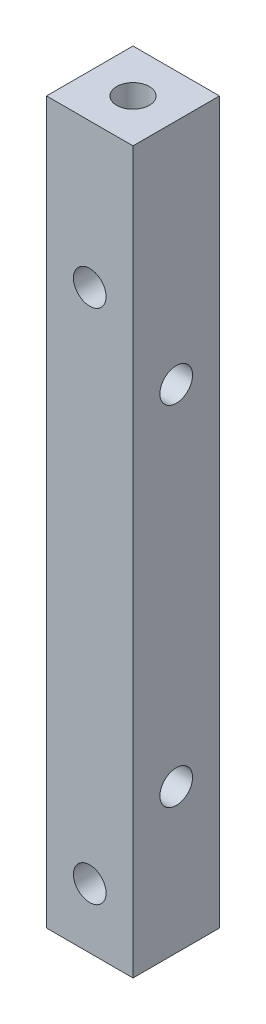
ISO-10303-21;
HEADER;
FILE_DESCRIPTION(('STEP AP214'),'2;1');
FILE_NAME('part.step','',(''),(''),'','','');
FILE_SCHEMA(('AUTOMOTIVE_DESIGN { 1 0 10303 214 1 1 1 1 }'));
ENDSEC;
DATA;
#1=APPLICATION_CONTEXT('core data for automotive mechanical design processes');
#2=APPLICATION_PROTOCOL_DEFINITION('international standard','automotive_design',2000,#1);
#3=PRODUCT_CONTEXT('',#1,'mechanical');
#4=PRODUCT('Part','Part','',(#3));
#5=PRODUCT_RELATED_PRODUCT_CATEGORY('part','',(#4));
#6=PRODUCT_DEFINITION_FORMATION('','',#4);
#7=PRODUCT_DEFINITION_CONTEXT('part definition',#1,'design');
#8=PRODUCT_DEFINITION('design','',#6,#7);
#9=PRODUCT_DEFINITION_SHAPE('','',#8);
#10=(LENGTH_UNIT() NAMED_UNIT(*) SI_UNIT(.MILLI.,.METRE.));
#11=(NAMED_UNIT(*) PLANE_ANGLE_UNIT() SI_UNIT($,.RADIAN.));
#12=(NAMED_UNIT(*) SI_UNIT($,.STERADIAN.) SOLID_ANGLE_UNIT());
#13=UNCERTAINTY_MEASURE_WITH_UNIT(LENGTH_MEASURE(1.E-05),#10,'distance_accuracy_value','');
#14=(GEOMETRIC_REPRESENTATION_CONTEXT(3) GLOBAL_UNCERTAINTY_ASSIGNED_CONTEXT((#13)) GLOBAL_UNIT_ASSIGNED_CONTEXT((#10,
#11,#12)) REPRESENTATION_CONTEXT('',''));
#15=CARTESIAN_POINT('',(0.,0.,0.));
#16=DIRECTION('',(0.,0.,1.));
#17=DIRECTION('',(1.,0.,0.));
#18=AXIS2_PLACEMENT_3D('',#15,#16,#17);
#19=CARTESIAN_POINT('',(4.572,76.2,-4.572));
#20=DIRECTION('',(-1.,0.,0.));
#21=DIRECTION('',(0.,0.,1.));
#22=AXIS2_PLACEMENT_3D('',#19,#20,#21);
#23=PLANE('',#22);
#24=CARTESIAN_POINT('',(4.572,52.07,0.));
#25=DIRECTION('',(1.,0.,0.));
#26=DIRECTION('',(0.,0.,-1.));
#27=AXIS2_PLACEMENT_3D('',#24,#25,#26);
#28=CIRCLE('',#27,1.7272);
#29=CARTESIAN_POINT('',(4.572,52.07,-1.7272));
#30=VERTEX_POINT('',#29);
#31=EDGE_CURVE('E101',#30,#30,#28,.T.);
#32=ORIENTED_EDGE('',*,*,#31,.F.);
#33=EDGE_LOOP('',(#32));
#34=FACE_BOUND('',#33,.T.);
#35=CARTESIAN_POINT('',(4.572,15.24,0.));
#36=DIRECTION('',(1.,0.,0.));
#37=DIRECTION('',(0.,0.,-1.));
#38=AXIS2_PLACEMENT_3D('',#35,#36,#37);
#39=CIRCLE('',#38,1.7272);
#40=CARTESIAN_POINT('',(4.572,15.24,-1.7272));
#41=VERTEX_POINT('',#40);
#42=EDGE_CURVE('E112',#41,#41,#39,.T.);
#43=ORIENTED_EDGE('',*,*,#42,.F.);
#44=EDGE_LOOP('',(#43));
#45=FACE_BOUND('',#44,.T.);
#46=DIRECTION('',(0.,0.,-1.));
#47=VECTOR('',#46,1.);
#48=CARTESIAN_POINT('',(4.572,0.,-4.572));
#49=LINE('',#48,#47);
#50=CARTESIAN_POINT('',(4.572,0.,4.572));
#51=VERTEX_POINT('',#50);
#52=CARTESIAN_POINT('',(4.572,0.,-4.572));
#53=VERTEX_POINT('',#52);
#54=EDGE_CURVE('E130',#51,#53,#49,.T.);
#55=ORIENTED_EDGE('',*,*,#54,.T.);
#56=DIRECTION('',(0.,-1.,0.));
#57=VECTOR('',#56,1.);
#58=CARTESIAN_POINT('',(4.572,76.2,-4.572));
#59=LINE('',#58,#57);
#60=CARTESIAN_POINT('',(4.572,76.2,-4.572));
#61=VERTEX_POINT('',#60);
#62=EDGE_CURVE('E11',#61,#53,#59,.T.);
#63=ORIENTED_EDGE('',*,*,#62,.F.);
#64=DIRECTION('',(0.,0.,-1.));
#65=VECTOR('',#64,1.);
#66=CARTESIAN_POINT('',(4.572,76.2,-4.572));
#67=LINE('',#66,#65);
#68=CARTESIAN_POINT('',(4.572,76.2,4.572));
#69=VERTEX_POINT('',#68);
#70=EDGE_CURVE('E131',#69,#61,#67,.T.);
#71=ORIENTED_EDGE('',*,*,#70,.F.);
#72=DIRECTION('',(0.,-1.,0.));
#73=VECTOR('',#72,1.);
#74=CARTESIAN_POINT('',(4.572,76.2,4.572));
#75=LINE('',#74,#73);
#76=EDGE_CURVE('E137',#69,#51,#75,.T.);
#77=ORIENTED_EDGE('',*,*,#76,.T.);
#78=EDGE_LOOP('',(#55,#63,#71,#77));
#79=FACE_BOUND('',#78,.T.);
#80=ADVANCED_FACE('F40',(#34,#45,#79),#23,.F.);
#81=CARTESIAN_POINT('',(-4.572,76.2,-4.572));
#82=DIRECTION('',(0.,0.,1.));
#83=DIRECTION('',(1.,0.,0.));
#84=AXIS2_PLACEMENT_3D('',#81,#82,#83);
#85=PLANE('',#84);
#86=CARTESIAN_POINT('',(0.,60.96,-4.572));
#87=DIRECTION('',(0.,0.,1.));
#88=DIRECTION('',(1.,0.,0.));
#89=AXIS2_PLACEMENT_3D('',#86,#87,#88);
#90=CIRCLE('',#89,1.7272);
#91=CARTESIAN_POINT('',(1.7272,60.96,-4.572));
#92=VERTEX_POINT('',#91);
#93=EDGE_CURVE('E121',#92,#92,#90,.T.);
#94=ORIENTED_EDGE('',*,*,#93,.T.);
#95=EDGE_LOOP('',(#94));
#96=FACE_BOUND('',#95,.T.);
#97=CARTESIAN_POINT('',(0.,6.35000000000001,-4.572));
#98=DIRECTION('',(0.,0.,1.));
#99=DIRECTION('',(1.,0.,0.));
#100=AXIS2_PLACEMENT_3D('',#97,#98,#99);
#101=CIRCLE('',#100,1.7272);
#102=CARTESIAN_POINT('',(1.72720000000001,6.35000000000001,-4.572));
#103=VERTEX_POINT('',#102);
#104=EDGE_CURVE('E127',#103,#103,#101,.T.);
#105=ORIENTED_EDGE('',*,*,#104,.T.);
#106=EDGE_LOOP('',(#105));
#107=FACE_BOUND('',#106,.T.);
#108=DIRECTION('',(-1.,0.,0.));
#109=VECTOR('',#108,1.);
#110=CARTESIAN_POINT('',(-4.572,0.,-4.572));
#111=LINE('',#110,#109);
#112=CARTESIAN_POINT('',(-4.572,0.,-4.572));
#113=VERTEX_POINT('',#112);
#114=EDGE_CURVE('E140',#53,#113,#111,.T.);
#115=ORIENTED_EDGE('',*,*,#114,.T.);
#116=DIRECTION('',(0.,-1.,0.));
#117=VECTOR('',#116,1.);
#118=CARTESIAN_POINT('',(-4.572,76.2,-4.572));
#119=LINE('',#118,#117);
#120=CARTESIAN_POINT('',(-4.572,76.2,-4.572));
#121=VERTEX_POINT('',#120);
#122=EDGE_CURVE('E48',#121,#113,#119,.T.);
#123=ORIENTED_EDGE('',*,*,#122,.F.);
#124=DIRECTION('',(-1.,0.,0.));
#125=VECTOR('',#124,1.);
#126=CARTESIAN_POINT('',(-4.572,76.2,-4.572));
#127=LINE('',#126,#125);
#128=EDGE_CURVE('E87',#61,#121,#127,.T.);
#129=ORIENTED_EDGE('',*,*,#128,.F.);
#130=ORIENTED_EDGE('',*,*,#62,.T.);
#131=EDGE_LOOP('',(#115,#123,#129,#130));
#132=FACE_BOUND('',#131,.T.);
#133=ADVANCED_FACE('F165',(#96,#107,#132),#85,.F.);
#134=CARTESIAN_POINT('',(-4.572,76.2,-4.572));
#135=DIRECTION('',(1.,0.,0.));
#136=DIRECTION('',(0.,0.,-1.));
#137=AXIS2_PLACEMENT_3D('',#134,#135,#136);
#138=PLANE('',#137);
#139=CARTESIAN_POINT('',(-4.572,52.07,0.));
#140=DIRECTION('',(1.,0.,0.));
#141=DIRECTION('',(0.,0.,-1.));
#142=AXIS2_PLACEMENT_3D('',#139,#140,#141);
#143=CIRCLE('',#142,1.7272);
#144=CARTESIAN_POINT('',(-4.572,52.07,-1.7272));
#145=VERTEX_POINT('',#144);
#146=EDGE_CURVE('E105',#145,#145,#143,.T.);
#147=ORIENTED_EDGE('',*,*,#146,.T.);
#148=EDGE_LOOP('',(#147));
#149=FACE_BOUND('',#148,.T.);
#150=CARTESIAN_POINT('',(-4.572,15.24,0.));
#151=DIRECTION('',(1.,0.,0.));
#152=DIRECTION('',(0.,0.,-1.));
#153=AXIS2_PLACEMENT_3D('',#150,#151,#152);
#154=CIRCLE('',#153,1.7272);
#155=CARTESIAN_POINT('',(-4.572,15.24,-1.7272));
#156=VERTEX_POINT('',#155);
#157=EDGE_CURVE('E115',#156,#156,#154,.T.);
#158=ORIENTED_EDGE('',*,*,#157,.T.);
#159=EDGE_LOOP('',(#158));
#160=FACE_BOUND('',#159,.T.);
#161=DIRECTION('',(0.,0.,1.));
#162=VECTOR('',#161,1.);
#163=CARTESIAN_POINT('',(-4.572,0.,-4.572));
#164=LINE('',#163,#162);
#165=CARTESIAN_POINT('',(-4.572,0.,4.572));
#166=VERTEX_POINT('',#165);
#167=EDGE_CURVE('E74',#113,#166,#164,.T.);
#168=ORIENTED_EDGE('',*,*,#167,.T.);
#169=DIRECTION('',(0.,-1.,0.));
#170=VECTOR('',#169,1.);
#171=CARTESIAN_POINT('',(-4.572,76.2,4.572));
#172=LINE('',#171,#170);
#173=CARTESIAN_POINT('',(-4.572,76.2,4.572));
#174=VERTEX_POINT('',#173);
#175=EDGE_CURVE('E145',#174,#166,#172,.T.);
#176=ORIENTED_EDGE('',*,*,#175,.F.);
#177=DIRECTION('',(0.,0.,1.));
#178=VECTOR('',#177,1.);
#179=CARTESIAN_POINT('',(-4.572,76.2,-4.572));
#180=LINE('',#179,#178);
#181=EDGE_CURVE('E134',#121,#174,#180,.T.);
#182=ORIENTED_EDGE('',*,*,#181,.F.);
#183=ORIENTED_EDGE('',*,*,#122,.T.);
#184=EDGE_LOOP('',(#168,#176,#182,#183));
#185=FACE_BOUND('',#184,.T.);
#186=ADVANCED_FACE('F147',(#149,#160,#185),#138,.F.);
#187=CARTESIAN_POINT('',(-4.572,76.2,4.572));
#188=DIRECTION('',(0.,0.,-1.));
#189=DIRECTION('',(-1.,0.,0.));
#190=AXIS2_PLACEMENT_3D('',#187,#188,#189);
#191=PLANE('',#190);
#192=CARTESIAN_POINT('',(0.,60.96,4.572));
#193=DIRECTION('',(0.,0.,1.));
#194=DIRECTION('',(1.,0.,0.));
#195=AXIS2_PLACEMENT_3D('',#192,#193,#194);
#196=CIRCLE('',#195,1.7272);
#197=CARTESIAN_POINT('',(1.7272,60.96,4.572));
#198=VERTEX_POINT('',#197);
#199=EDGE_CURVE('E118',#198,#198,#196,.T.);
#200=ORIENTED_EDGE('',*,*,#199,.F.);
#201=EDGE_LOOP('',(#200));
#202=FACE_BOUND('',#201,.T.);
#203=CARTESIAN_POINT('',(0.,6.35000000000001,4.572));
#204=DIRECTION('',(0.,0.,1.));
#205=DIRECTION('',(1.,0.,0.));
#206=AXIS2_PLACEMENT_3D('',#203,#204,#205);
#207=CIRCLE('',#206,1.7272);
#208=CARTESIAN_POINT('',(1.72720000000001,6.35000000000001,4.572));
#209=VERTEX_POINT('',#208);
#210=EDGE_CURVE('E124',#209,#209,#207,.T.);
#211=ORIENTED_EDGE('',*,*,#210,.F.);
#212=EDGE_LOOP('',(#211));
#213=FACE_BOUND('',#212,.T.);
#214=DIRECTION('',(1.,0.,0.));
#215=VECTOR('',#214,1.);
#216=CARTESIAN_POINT('',(-4.572,0.,4.572));
#217=LINE('',#216,#215);
#218=EDGE_CURVE('E80',#166,#51,#217,.T.);
#219=ORIENTED_EDGE('',*,*,#218,.T.);
#220=ORIENTED_EDGE('',*,*,#76,.F.);
#221=DIRECTION('',(1.,0.,0.));
#222=VECTOR('',#221,1.);
#223=CARTESIAN_POINT('',(-4.572,76.2,4.572));
#224=LINE('',#223,#222);
#225=EDGE_CURVE('E56',#174,#69,#224,.T.);
#226=ORIENTED_EDGE('',*,*,#225,.F.);
#227=ORIENTED_EDGE('',*,*,#175,.T.);
#228=EDGE_LOOP('',(#219,#220,#226,#227));
#229=FACE_BOUND('',#228,.T.);
#230=ADVANCED_FACE('F154',(#202,#213,#229),#191,.F.);
#231=CARTESIAN_POINT('',(0.,76.2,0.));
#232=DIRECTION('',(0.,1.,0.));
#233=DIRECTION('',(0.,0.,1.));
#234=AXIS2_PLACEMENT_3D('',#231,#232,#233);
#235=PLANE('',#234);
#236=CARTESIAN_POINT('',(0.,76.2,0.));
#237=DIRECTION('',(0.,1.,0.));
#238=DIRECTION('',(0.,0.,1.));
#239=AXIS2_PLACEMENT_3D('',#236,#237,#238);
#240=CIRCLE('',#239,1.72719999999999);
#241=CARTESIAN_POINT('',(0.,76.2,1.72719999999999));
#242=VERTEX_POINT('',#241);
#243=EDGE_CURVE('E102',#242,#242,#240,.T.);
#244=ORIENTED_EDGE('',*,*,#243,.F.);
#245=EDGE_LOOP('',(#244));
#246=FACE_BOUND('',#245,.T.);
#247=ORIENTED_EDGE('',*,*,#70,.T.);
#248=ORIENTED_EDGE('',*,*,#128,.T.);
#249=ORIENTED_EDGE('',*,*,#181,.T.);
#250=ORIENTED_EDGE('',*,*,#225,.T.);
#251=EDGE_LOOP('',(#247,#248,#249,#250));
#252=FACE_BOUND('',#251,.T.);
#253=ADVANCED_FACE('F156',(#246,#252),#235,.T.);
#254=CARTESIAN_POINT('',(0.,0.,0.));
#255=DIRECTION('',(0.,1.,0.));
#256=DIRECTION('',(0.,0.,1.));
#257=AXIS2_PLACEMENT_3D('',#254,#255,#256);
#258=PLANE('',#257);
#259=ORIENTED_EDGE('',*,*,#54,.F.);
#260=ORIENTED_EDGE('',*,*,#218,.F.);
#261=ORIENTED_EDGE('',*,*,#167,.F.);
#262=ORIENTED_EDGE('',*,*,#114,.F.);
#263=EDGE_LOOP('',(#259,#260,#261,#262));
#264=FACE_BOUND('',#263,.T.);
#265=ADVANCED_FACE('F150',(#264),#258,.F.);
#266=CARTESIAN_POINT('',(0.,6.35000000000001,4.572));
#267=DIRECTION('',(0.,0.,1.));
#268=DIRECTION('',(1.,0.,0.));
#269=AXIS2_PLACEMENT_3D('',#266,#267,#268);
#270=CYLINDRICAL_SURFACE('',#269,1.7272);
#271=ORIENTED_EDGE('',*,*,#104,.F.);
#272=EDGE_LOOP('',(#271));
#273=FACE_BOUND('',#272,.T.);
#274=ORIENTED_EDGE('',*,*,#210,.T.);
#275=EDGE_LOOP('',(#274));
#276=FACE_BOUND('',#275,.T.);
#277=ADVANCED_FACE('F192',(#273,#276),#270,.F.);
#278=CARTESIAN_POINT('',(0.,60.96,4.572));
#279=DIRECTION('',(0.,0.,1.));
#280=DIRECTION('',(1.,0.,0.));
#281=AXIS2_PLACEMENT_3D('',#278,#279,#280);
#282=CYLINDRICAL_SURFACE('',#281,1.7272);
#283=ORIENTED_EDGE('',*,*,#93,.F.);
#284=EDGE_LOOP('',(#283));
#285=FACE_BOUND('',#284,.T.);
#286=ORIENTED_EDGE('',*,*,#199,.T.);
#287=EDGE_LOOP('',(#286));
#288=FACE_BOUND('',#287,.T.);
#289=ADVANCED_FACE('F183',(#285,#288),#282,.F.);
#290=CARTESIAN_POINT('',(4.572,15.24,0.));
#291=DIRECTION('',(1.,0.,0.));
#292=DIRECTION('',(0.,0.,-1.));
#293=AXIS2_PLACEMENT_3D('',#290,#291,#292);
#294=CYLINDRICAL_SURFACE('',#293,1.7272);
#295=ORIENTED_EDGE('',*,*,#157,.F.);
#296=EDGE_LOOP('',(#295));
#297=FACE_BOUND('',#296,.T.);
#298=ORIENTED_EDGE('',*,*,#42,.T.);
#299=EDGE_LOOP('',(#298));
#300=FACE_BOUND('',#299,.T.);
#301=ADVANCED_FACE('F181',(#297,#300),#294,.F.);
#302=CARTESIAN_POINT('',(4.572,52.07,0.));
#303=DIRECTION('',(1.,0.,0.));
#304=DIRECTION('',(0.,0.,-1.));
#305=AXIS2_PLACEMENT_3D('',#302,#303,#304);
#306=CYLINDRICAL_SURFACE('',#305,1.7272);
#307=ORIENTED_EDGE('',*,*,#146,.F.);
#308=EDGE_LOOP('',(#307));
#309=FACE_BOUND('',#308,.T.);
#310=ORIENTED_EDGE('',*,*,#31,.T.);
#311=EDGE_LOOP('',(#310));
#312=FACE_BOUND('',#311,.T.);
#313=ADVANCED_FACE('F95',(#309,#312),#306,.F.);
#314=CARTESIAN_POINT('',(0.,68.58,0.));
#315=DIRECTION('',(0.,1.,0.));
#316=DIRECTION('',(0.,0.,1.));
#317=AXIS2_PLACEMENT_3D('',#314,#315,#316);
#318=CONICAL_SURFACE('',#317,1.7272,1.02974425867665);
#319=CARTESIAN_POINT('',(0.,67.5421935388156,0.));
#320=VERTEX_POINT('',#319);
#321=VERTEX_LOOP('',#320);
#322=FACE_BOUND('',#321,.T.);
#323=CARTESIAN_POINT('',(0.,68.58,0.));
#324=DIRECTION('',(0.,1.,0.));
#325=DIRECTION('',(0.,0.,1.));
#326=AXIS2_PLACEMENT_3D('',#323,#324,#325);
#327=CIRCLE('',#326,1.7272);
#328=CARTESIAN_POINT('',(0.,68.58,1.7272));
#329=VERTEX_POINT('',#328);
#330=EDGE_CURVE('E99',#329,#329,#327,.T.);
#331=ORIENTED_EDGE('',*,*,#330,.T.);
#332=EDGE_LOOP('',(#331));
#333=FACE_BOUND('',#332,.T.);
#334=ADVANCED_FACE('F91',(#322,#333),#318,.F.);
#335=CARTESIAN_POINT('',(0.,76.2,0.));
#336=DIRECTION('',(0.,1.,0.));
#337=DIRECTION('',(0.,0.,1.));
#338=AXIS2_PLACEMENT_3D('',#335,#336,#337);
#339=CYLINDRICAL_SURFACE('',#338,1.72719999999999);
#340=ORIENTED_EDGE('',*,*,#330,.F.);
#341=EDGE_LOOP('',(#340));
#342=FACE_BOUND('',#341,.T.);
#343=ORIENTED_EDGE('',*,*,#243,.T.);
#344=EDGE_LOOP('',(#343));
#345=FACE_BOUND('',#344,.T.);
#346=ADVANCED_FACE('F94',(#342,#345),#339,.F.);
#347=CLOSED_SHELL('',(#80,#133,#186,#230,#253,#265,#277,#289,#301,#313,#334,#346));
#348=MANIFOLD_SOLID_BREP('B2',#347);
#349=ADVANCED_BREP_SHAPE_REPRESENTATION('',(#18,#348),#14);
#350=SHAPE_DEFINITION_REPRESENTATION(#9,#349);
ENDSEC;
END-ISO-10303-21;
